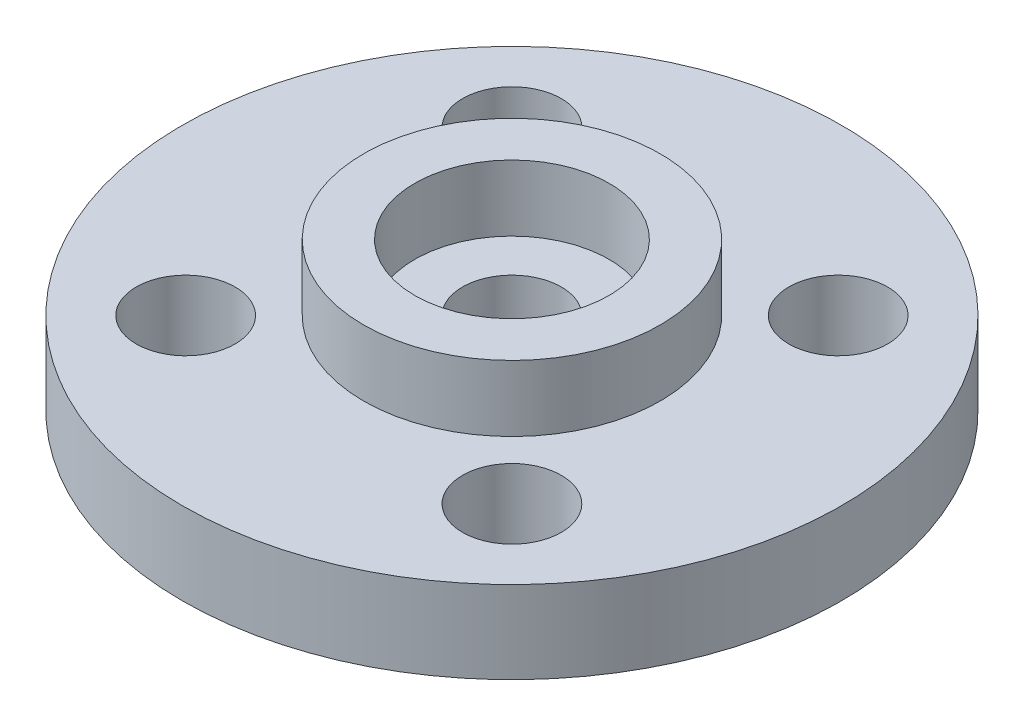
ISO-10303-21;
HEADER;
FILE_DESCRIPTION(('STEP AP214'),'2;1');
FILE_NAME('part.step','',(''),(''),'','','');
FILE_SCHEMA(('AUTOMOTIVE_DESIGN { 1 0 10303 214 1 1 1 1 }'));
ENDSEC;
DATA;
#1=APPLICATION_CONTEXT('core data for automotive mechanical design processes');
#2=APPLICATION_PROTOCOL_DEFINITION('international standard','automotive_design',2000,#1);
#3=PRODUCT_CONTEXT('',#1,'mechanical');
#4=PRODUCT('Part','Part','',(#3));
#5=PRODUCT_RELATED_PRODUCT_CATEGORY('part','',(#4));
#6=PRODUCT_DEFINITION_FORMATION('','',#4);
#7=PRODUCT_DEFINITION_CONTEXT('part definition',#1,'design');
#8=PRODUCT_DEFINITION('design','',#6,#7);
#9=PRODUCT_DEFINITION_SHAPE('','',#8);
#10=(LENGTH_UNIT() NAMED_UNIT(*) SI_UNIT(.MILLI.,.METRE.));
#11=(NAMED_UNIT(*) PLANE_ANGLE_UNIT() SI_UNIT($,.RADIAN.));
#12=(NAMED_UNIT(*) SI_UNIT($,.STERADIAN.) SOLID_ANGLE_UNIT());
#13=UNCERTAINTY_MEASURE_WITH_UNIT(LENGTH_MEASURE(1.E-05),#10,'distance_accuracy_value','');
#14=(GEOMETRIC_REPRESENTATION_CONTEXT(3) GLOBAL_UNCERTAINTY_ASSIGNED_CONTEXT((#13)) GLOBAL_UNIT_ASSIGNED_CONTEXT((#10,
#11,#12)) REPRESENTATION_CONTEXT('',''));
#15=CARTESIAN_POINT('',(0.,0.,0.));
#16=DIRECTION('',(0.,0.,1.));
#17=DIRECTION('',(1.,0.,0.));
#18=AXIS2_PLACEMENT_3D('',#15,#16,#17);
#19=CARTESIAN_POINT('',(0.,2.5,0.));
#20=DIRECTION('',(0.,1.,0.));
#21=DIRECTION('',(0.,0.,1.));
#22=AXIS2_PLACEMENT_3D('',#19,#20,#21);
#23=PLANE('',#22);
#24=CARTESIAN_POINT('',(0.,2.5,0.));
#25=DIRECTION('',(0.,1.,0.));
#26=DIRECTION('',(0.,0.,1.));
#27=AXIS2_PLACEMENT_3D('',#24,#25,#26);
#28=CIRCLE('',#27,1.5);
#29=CARTESIAN_POINT('',(0.,2.5,1.5));
#30=VERTEX_POINT('',#29);
#31=EDGE_CURVE('E65',#30,#30,#28,.T.);
#32=ORIENTED_EDGE('',*,*,#31,.F.);
#33=EDGE_LOOP('',(#32));
#34=FACE_BOUND('',#33,.T.);
#35=CARTESIAN_POINT('',(0.,2.5,0.));
#36=DIRECTION('',(0.,1.,0.));
#37=DIRECTION('',(0.,0.,1.));
#38=AXIS2_PLACEMENT_3D('',#35,#36,#37);
#39=CIRCLE('',#38,2.95);
#40=CARTESIAN_POINT('',(0.,2.5,2.95));
#41=VERTEX_POINT('',#40);
#42=EDGE_CURVE('E10',#41,#41,#39,.F.);
#43=ORIENTED_EDGE('',*,*,#42,.F.);
#44=EDGE_LOOP('',(#43));
#45=FACE_BOUND('',#44,.T.);
#46=ADVANCED_FACE('F32',(#34,#45),#23,.T.);
#47=CARTESIAN_POINT('',(0.,2.5,0.));
#48=DIRECTION('',(0.,1.,0.));
#49=DIRECTION('',(0.,0.,1.));
#50=AXIS2_PLACEMENT_3D('',#47,#48,#49);
#51=CIRCLE('',#50,4.5);
#52=CARTESIAN_POINT('',(0.,2.5,4.5));
#53=VERTEX_POINT('',#52);
#54=EDGE_CURVE('E80',#53,#53,#51,.T.);
#55=ORIENTED_EDGE('',*,*,#54,.F.);
#56=EDGE_LOOP('',(#55));
#57=FACE_BOUND('',#56,.T.);
#58=CARTESIAN_POINT('',(-4.94974746830583,2.5,4.94974746830583));
#59=DIRECTION('',(0.,1.,0.));
#60=DIRECTION('',(0.,0.,1.));
#61=AXIS2_PLACEMENT_3D('',#58,#59,#60);
#62=CIRCLE('',#61,1.5);
#63=CARTESIAN_POINT('',(-4.94974746830583,2.5,6.44974746830583));
#64=VERTEX_POINT('',#63);
#65=EDGE_CURVE('E53',#64,#64,#62,.T.);
#66=ORIENTED_EDGE('',*,*,#65,.F.);
#67=EDGE_LOOP('',(#66));
#68=FACE_BOUND('',#67,.T.);
#69=CARTESIAN_POINT('',(0.,2.5,0.));
#70=DIRECTION('',(0.,1.,0.));
#71=DIRECTION('',(0.,0.,1.));
#72=AXIS2_PLACEMENT_3D('',#69,#70,#71);
#73=CIRCLE('',#72,10.);
#74=CARTESIAN_POINT('',(0.,2.5,10.));
#75=VERTEX_POINT('',#74);
#76=EDGE_CURVE('E39',#75,#75,#73,.T.);
#77=ORIENTED_EDGE('',*,*,#76,.T.);
#78=EDGE_LOOP('',(#77));
#79=FACE_BOUND('',#78,.T.);
#80=CARTESIAN_POINT('',(-4.94974746830583,2.5,-4.94974746830583));
#81=DIRECTION('',(0.,1.,0.));
#82=DIRECTION('',(0.,0.,1.));
#83=AXIS2_PLACEMENT_3D('',#80,#81,#82);
#84=CIRCLE('',#83,1.5);
#85=CARTESIAN_POINT('',(-4.94974746830583,2.5,-3.44974746830583));
#86=VERTEX_POINT('',#85);
#87=EDGE_CURVE('E48',#86,#86,#84,.T.);
#88=ORIENTED_EDGE('',*,*,#87,.F.);
#89=EDGE_LOOP('',(#88));
#90=FACE_BOUND('',#89,.T.);
#91=CARTESIAN_POINT('',(4.94974746830583,2.5,4.94974746830583));
#92=DIRECTION('',(0.,1.,0.));
#93=DIRECTION('',(0.,0.,1.));
#94=AXIS2_PLACEMENT_3D('',#91,#92,#93);
#95=CIRCLE('',#94,1.5);
#96=CARTESIAN_POINT('',(4.94974746830583,2.5,6.44974746830583));
#97=VERTEX_POINT('',#96);
#98=EDGE_CURVE('E59',#97,#97,#95,.T.);
#99=ORIENTED_EDGE('',*,*,#98,.F.);
#100=EDGE_LOOP('',(#99));
#101=FACE_BOUND('',#100,.T.);
#102=CARTESIAN_POINT('',(4.94974746830583,2.5,-4.94974746830583));
#103=DIRECTION('',(0.,1.,0.));
#104=DIRECTION('',(0.,0.,1.));
#105=AXIS2_PLACEMENT_3D('',#102,#103,#104);
#106=CIRCLE('',#105,1.5);
#107=CARTESIAN_POINT('',(4.94974746830583,2.5,-3.44974746830583));
#108=VERTEX_POINT('',#107);
#109=EDGE_CURVE('E71',#108,#108,#106,.T.);
#110=ORIENTED_EDGE('',*,*,#109,.F.);
#111=EDGE_LOOP('',(#110));
#112=FACE_BOUND('',#111,.T.);
#113=ADVANCED_FACE('F108',(#57,#68,#79,#90,#101,#112),#23,.T.);
#114=CARTESIAN_POINT('',(0.,0.,0.));
#115=DIRECTION('',(0.,1.,0.));
#116=DIRECTION('',(0.,0.,1.));
#117=AXIS2_PLACEMENT_3D('',#114,#115,#116);
#118=PLANE('',#117);
#119=CARTESIAN_POINT('',(0.,0.,0.));
#120=DIRECTION('',(0.,1.,0.));
#121=DIRECTION('',(0.,0.,1.));
#122=AXIS2_PLACEMENT_3D('',#119,#120,#121);
#123=CIRCLE('',#122,10.);
#124=CARTESIAN_POINT('',(0.,0.,10.));
#125=VERTEX_POINT('',#124);
#126=EDGE_CURVE('E43',#125,#125,#123,.T.);
#127=ORIENTED_EDGE('',*,*,#126,.F.);
#128=EDGE_LOOP('',(#127));
#129=FACE_BOUND('',#128,.T.);
#130=CARTESIAN_POINT('',(-4.94974746830583,0.,-4.94974746830583));
#131=DIRECTION('',(0.,1.,0.));
#132=DIRECTION('',(0.,0.,1.));
#133=AXIS2_PLACEMENT_3D('',#130,#131,#132);
#134=CIRCLE('',#133,1.5);
#135=CARTESIAN_POINT('',(-4.94974746830583,0.,-3.44974746830583));
#136=VERTEX_POINT('',#135);
#137=EDGE_CURVE('E50',#136,#136,#134,.T.);
#138=ORIENTED_EDGE('',*,*,#137,.T.);
#139=EDGE_LOOP('',(#138));
#140=FACE_BOUND('',#139,.T.);
#141=CARTESIAN_POINT('',(-4.94974746830583,0.,4.94974746830583));
#142=DIRECTION('',(0.,1.,0.));
#143=DIRECTION('',(0.,0.,1.));
#144=AXIS2_PLACEMENT_3D('',#141,#142,#143);
#145=CIRCLE('',#144,1.5);
#146=CARTESIAN_POINT('',(-4.94974746830583,0.,6.44974746830583));
#147=VERTEX_POINT('',#146);
#148=EDGE_CURVE('E56',#147,#147,#145,.T.);
#149=ORIENTED_EDGE('',*,*,#148,.T.);
#150=EDGE_LOOP('',(#149));
#151=FACE_BOUND('',#150,.T.);
#152=CARTESIAN_POINT('',(4.94974746830583,0.,4.94974746830583));
#153=DIRECTION('',(0.,1.,0.));
#154=DIRECTION('',(0.,0.,1.));
#155=AXIS2_PLACEMENT_3D('',#152,#153,#154);
#156=CIRCLE('',#155,1.5);
#157=CARTESIAN_POINT('',(4.94974746830583,0.,6.44974746830583));
#158=VERTEX_POINT('',#157);
#159=EDGE_CURVE('E62',#158,#158,#156,.T.);
#160=ORIENTED_EDGE('',*,*,#159,.T.);
#161=EDGE_LOOP('',(#160));
#162=FACE_BOUND('',#161,.T.);
#163=CARTESIAN_POINT('',(0.,0.,0.));
#164=DIRECTION('',(0.,1.,0.));
#165=DIRECTION('',(0.,0.,1.));
#166=AXIS2_PLACEMENT_3D('',#163,#164,#165);
#167=CIRCLE('',#166,1.5);
#168=CARTESIAN_POINT('',(0.,0.,1.5));
#169=VERTEX_POINT('',#168);
#170=EDGE_CURVE('E68',#169,#169,#167,.T.);
#171=ORIENTED_EDGE('',*,*,#170,.T.);
#172=EDGE_LOOP('',(#171));
#173=FACE_BOUND('',#172,.T.);
#174=CARTESIAN_POINT('',(4.94974746830583,0.,-4.94974746830583));
#175=DIRECTION('',(0.,1.,0.));
#176=DIRECTION('',(0.,0.,1.));
#177=AXIS2_PLACEMENT_3D('',#174,#175,#176);
#178=CIRCLE('',#177,1.5);
#179=CARTESIAN_POINT('',(4.94974746830583,0.,-3.44974746830583));
#180=VERTEX_POINT('',#179);
#181=EDGE_CURVE('E74',#180,#180,#178,.T.);
#182=ORIENTED_EDGE('',*,*,#181,.T.);
#183=EDGE_LOOP('',(#182));
#184=FACE_BOUND('',#183,.T.);
#185=ADVANCED_FACE('F114',(#129,#140,#151,#162,#173,#184),#118,.F.);
#186=CARTESIAN_POINT('',(0.,2.5,0.));
#187=DIRECTION('',(0.,-1.,0.));
#188=DIRECTION('',(0.,0.,-1.));
#189=AXIS2_PLACEMENT_3D('',#186,#187,#188);
#190=CYLINDRICAL_SURFACE('',#189,10.);
#191=ORIENTED_EDGE('',*,*,#76,.F.);
#192=EDGE_LOOP('',(#191));
#193=FACE_BOUND('',#192,.T.);
#194=ORIENTED_EDGE('',*,*,#126,.T.);
#195=EDGE_LOOP('',(#194));
#196=FACE_BOUND('',#195,.T.);
#197=ADVANCED_FACE('F34',(#193,#196),#190,.T.);
#198=CARTESIAN_POINT('',(-4.94974746830583,2.5,-4.94974746830583));
#199=DIRECTION('',(0.,-1.,0.));
#200=DIRECTION('',(0.,0.,-1.));
#201=AXIS2_PLACEMENT_3D('',#198,#199,#200);
#202=CYLINDRICAL_SURFACE('',#201,1.5);
#203=ORIENTED_EDGE('',*,*,#87,.T.);
#204=EDGE_LOOP('',(#203));
#205=FACE_BOUND('',#204,.T.);
#206=ORIENTED_EDGE('',*,*,#137,.F.);
#207=EDGE_LOOP('',(#206));
#208=FACE_BOUND('',#207,.T.);
#209=ADVANCED_FACE('F119',(#205,#208),#202,.F.);
#210=CARTESIAN_POINT('',(-4.94974746830583,2.5,4.94974746830583));
#211=DIRECTION('',(0.,-1.,0.));
#212=DIRECTION('',(0.,0.,-1.));
#213=AXIS2_PLACEMENT_3D('',#210,#211,#212);
#214=CYLINDRICAL_SURFACE('',#213,1.5);
#215=ORIENTED_EDGE('',*,*,#65,.T.);
#216=EDGE_LOOP('',(#215));
#217=FACE_BOUND('',#216,.T.);
#218=ORIENTED_EDGE('',*,*,#148,.F.);
#219=EDGE_LOOP('',(#218));
#220=FACE_BOUND('',#219,.T.);
#221=ADVANCED_FACE('F147',(#217,#220),#214,.F.);
#222=CARTESIAN_POINT('',(4.94974746830583,2.5,4.94974746830583));
#223=DIRECTION('',(0.,-1.,0.));
#224=DIRECTION('',(0.,0.,-1.));
#225=AXIS2_PLACEMENT_3D('',#222,#223,#224);
#226=CYLINDRICAL_SURFACE('',#225,1.5);
#227=ORIENTED_EDGE('',*,*,#98,.T.);
#228=EDGE_LOOP('',(#227));
#229=FACE_BOUND('',#228,.T.);
#230=ORIENTED_EDGE('',*,*,#159,.F.);
#231=EDGE_LOOP('',(#230));
#232=FACE_BOUND('',#231,.T.);
#233=ADVANCED_FACE('F141',(#229,#232),#226,.F.);
#234=CARTESIAN_POINT('',(0.,2.5,0.));
#235=DIRECTION('',(0.,-1.,0.));
#236=DIRECTION('',(0.,0.,-1.));
#237=AXIS2_PLACEMENT_3D('',#234,#235,#236);
#238=CYLINDRICAL_SURFACE('',#237,1.5);
#239=ORIENTED_EDGE('',*,*,#31,.T.);
#240=EDGE_LOOP('',(#239));
#241=FACE_BOUND('',#240,.T.);
#242=ORIENTED_EDGE('',*,*,#170,.F.);
#243=EDGE_LOOP('',(#242));
#244=FACE_BOUND('',#243,.T.);
#245=ADVANCED_FACE('F103',(#241,#244),#238,.F.);
#246=CARTESIAN_POINT('',(4.94974746830583,2.5,-4.94974746830583));
#247=DIRECTION('',(0.,-1.,0.));
#248=DIRECTION('',(0.,0.,-1.));
#249=AXIS2_PLACEMENT_3D('',#246,#247,#248);
#250=CYLINDRICAL_SURFACE('',#249,1.5);
#251=ORIENTED_EDGE('',*,*,#109,.T.);
#252=EDGE_LOOP('',(#251));
#253=FACE_BOUND('',#252,.T.);
#254=ORIENTED_EDGE('',*,*,#181,.F.);
#255=EDGE_LOOP('',(#254));
#256=FACE_BOUND('',#255,.T.);
#257=ADVANCED_FACE('F94',(#253,#256),#250,.F.);
#258=CARTESIAN_POINT('',(0.,4.5,0.));
#259=DIRECTION('',(0.,1.,0.));
#260=DIRECTION('',(0.,0.,1.));
#261=AXIS2_PLACEMENT_3D('',#258,#259,#260);
#262=PLANE('',#261);
#263=CARTESIAN_POINT('',(0.,4.5,0.));
#264=DIRECTION('',(0.,1.,0.));
#265=DIRECTION('',(0.,0.,1.));
#266=AXIS2_PLACEMENT_3D('',#263,#264,#265);
#267=CIRCLE('',#266,4.5);
#268=CARTESIAN_POINT('',(0.,4.5,4.5));
#269=VERTEX_POINT('',#268);
#270=EDGE_CURVE('E77',#269,#269,#267,.T.);
#271=ORIENTED_EDGE('',*,*,#270,.T.);
#272=EDGE_LOOP('',(#271));
#273=FACE_BOUND('',#272,.T.);
#274=CARTESIAN_POINT('',(0.,4.5,0.));
#275=DIRECTION('',(0.,1.,0.));
#276=DIRECTION('',(0.,0.,1.));
#277=AXIS2_PLACEMENT_3D('',#274,#275,#276);
#278=CIRCLE('',#277,2.95);
#279=CARTESIAN_POINT('',(0.,4.5,2.95));
#280=VERTEX_POINT('',#279);
#281=EDGE_CURVE('E83',#280,#280,#278,.T.);
#282=ORIENTED_EDGE('',*,*,#281,.F.);
#283=EDGE_LOOP('',(#282));
#284=FACE_BOUND('',#283,.T.);
#285=ADVANCED_FACE('F91',(#273,#284),#262,.T.);
#286=CARTESIAN_POINT('',(0.,4.5,0.));
#287=DIRECTION('',(0.,-1.,0.));
#288=DIRECTION('',(0.,0.,-1.));
#289=AXIS2_PLACEMENT_3D('',#286,#287,#288);
#290=CYLINDRICAL_SURFACE('',#289,4.5);
#291=ORIENTED_EDGE('',*,*,#270,.F.);
#292=EDGE_LOOP('',(#291));
#293=FACE_BOUND('',#292,.T.);
#294=ORIENTED_EDGE('',*,*,#54,.T.);
#295=EDGE_LOOP('',(#294));
#296=FACE_BOUND('',#295,.T.);
#297=ADVANCED_FACE('F93',(#293,#296),#290,.T.);
#298=CARTESIAN_POINT('',(0.,4.5,0.));
#299=DIRECTION('',(0.,-1.,0.));
#300=DIRECTION('',(0.,0.,-1.));
#301=AXIS2_PLACEMENT_3D('',#298,#299,#300);
#302=CYLINDRICAL_SURFACE('',#301,2.95);
#303=ORIENTED_EDGE('',*,*,#281,.T.);
#304=EDGE_LOOP('',(#303));
#305=FACE_BOUND('',#304,.T.);
#306=ORIENTED_EDGE('',*,*,#42,.T.);
#307=EDGE_LOOP('',(#306));
#308=FACE_BOUND('',#307,.T.);
#309=ADVANCED_FACE('F89',(#305,#308),#302,.F.);
#310=CLOSED_SHELL('',(#46,#113,#185,#197,#209,#221,#233,#245,#257,#285,#297,#309));
#311=MANIFOLD_SOLID_BREP('B2',#310);
#312=ADVANCED_BREP_SHAPE_REPRESENTATION('',(#18,#311),#14);
#313=SHAPE_DEFINITION_REPRESENTATION(#9,#312);
ENDSEC;
END-ISO-10303-21;
